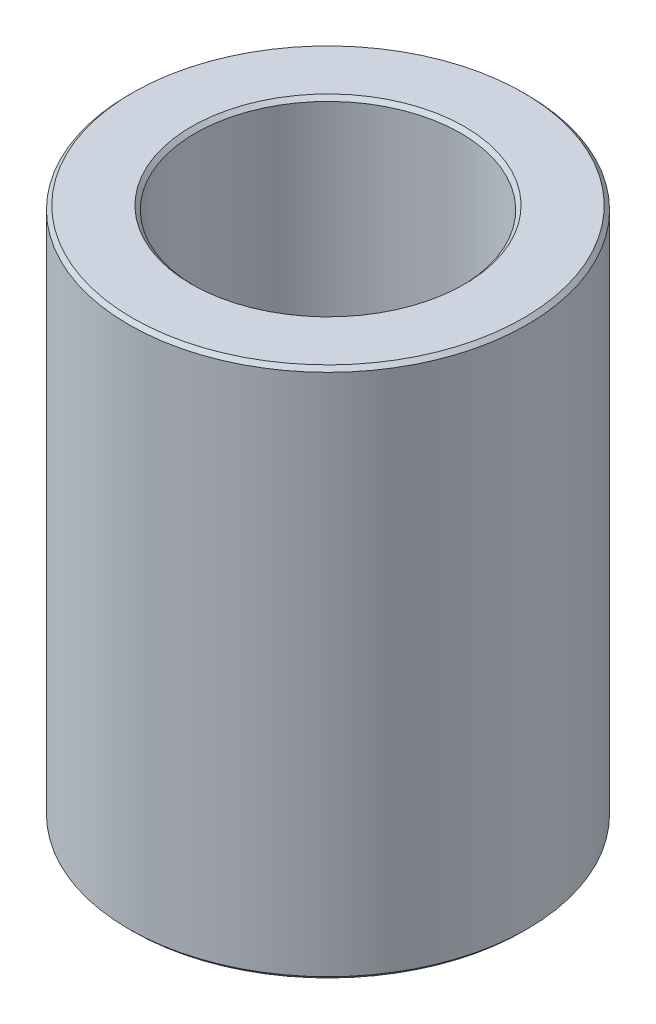
ISO-10303-21;
HEADER;
FILE_DESCRIPTION(('STEP AP214'),'2;1');
FILE_NAME('part.step','',(''),(''),'','','');
FILE_SCHEMA(('AUTOMOTIVE_DESIGN { 1 0 10303 214 1 1 1 1 }'));
ENDSEC;
DATA;
#1=APPLICATION_CONTEXT('core data for automotive mechanical design processes');
#2=APPLICATION_PROTOCOL_DEFINITION('international standard','automotive_design',2000,#1);
#3=PRODUCT_CONTEXT('',#1,'mechanical');
#4=PRODUCT('Part','Part','',(#3));
#5=PRODUCT_RELATED_PRODUCT_CATEGORY('part','',(#4));
#6=PRODUCT_DEFINITION_FORMATION('','',#4);
#7=PRODUCT_DEFINITION_CONTEXT('part definition',#1,'design');
#8=PRODUCT_DEFINITION('design','',#6,#7);
#9=PRODUCT_DEFINITION_SHAPE('','',#8);
#10=(LENGTH_UNIT() NAMED_UNIT(*) SI_UNIT(.MILLI.,.METRE.));
#11=(NAMED_UNIT(*) PLANE_ANGLE_UNIT() SI_UNIT($,.RADIAN.));
#12=(NAMED_UNIT(*) SI_UNIT($,.STERADIAN.) SOLID_ANGLE_UNIT());
#13=UNCERTAINTY_MEASURE_WITH_UNIT(LENGTH_MEASURE(1.E-05),#10,'distance_accuracy_value','');
#14=(GEOMETRIC_REPRESENTATION_CONTEXT(3) GLOBAL_UNCERTAINTY_ASSIGNED_CONTEXT((#13)) GLOBAL_UNIT_ASSIGNED_CONTEXT((#10,
#11,#12)) REPRESENTATION_CONTEXT('',''));
#15=CARTESIAN_POINT('',(0.,0.,0.));
#16=DIRECTION('',(0.,0.,1.));
#17=DIRECTION('',(1.,0.,0.));
#18=AXIS2_PLACEMENT_3D('',#15,#16,#17);
#19=CARTESIAN_POINT('',(0.,-14.,0.));
#20=DIRECTION('',(0.,1.,0.));
#21=DIRECTION('',(0.,0.,1.));
#22=AXIS2_PLACEMENT_3D('',#19,#20,#21);
#23=CYLINDRICAL_SURFACE('',#22,10.5);
#24=CARTESIAN_POINT('',(0.,-13.8,0.));
#25=DIRECTION('',(0.,1.,0.));
#26=DIRECTION('',(0.,0.,1.));
#27=AXIS2_PLACEMENT_3D('',#24,#25,#26);
#28=CIRCLE('',#27,10.5);
#29=CARTESIAN_POINT('',(0.,-13.8,10.5));
#30=VERTEX_POINT('',#29);
#31=EDGE_CURVE('E41',#30,#30,#28,.T.);
#32=ORIENTED_EDGE('',*,*,#31,.T.);
#33=EDGE_LOOP('',(#32));
#34=FACE_BOUND('',#33,.T.);
#35=CARTESIAN_POINT('',(0.,13.8,0.));
#36=DIRECTION('',(0.,1.,0.));
#37=DIRECTION('',(0.,0.,1.));
#38=AXIS2_PLACEMENT_3D('',#35,#36,#37);
#39=CIRCLE('',#38,10.5);
#40=CARTESIAN_POINT('',(0.,13.8,10.5));
#41=VERTEX_POINT('',#40);
#42=EDGE_CURVE('E45',#41,#41,#39,.F.);
#43=ORIENTED_EDGE('',*,*,#42,.T.);
#44=EDGE_LOOP('',(#43));
#45=FACE_BOUND('',#44,.T.);
#46=ADVANCED_FACE('F30',(#34,#45),#23,.T.);
#47=CARTESIAN_POINT('',(0.,-14.,0.));
#48=DIRECTION('',(0.,1.,0.));
#49=DIRECTION('',(0.,0.,1.));
#50=AXIS2_PLACEMENT_3D('',#47,#48,#49);
#51=PLANE('',#50);
#52=CARTESIAN_POINT('',(0.,-14.,0.));
#53=DIRECTION('',(0.,1.,0.));
#54=DIRECTION('',(0.,0.,1.));
#55=AXIS2_PLACEMENT_3D('',#52,#53,#54);
#56=CIRCLE('',#55,7.2);
#57=CARTESIAN_POINT('',(0.,-14.,7.2));
#58=VERTEX_POINT('',#57);
#59=EDGE_CURVE('E56',#58,#58,#56,.T.);
#60=ORIENTED_EDGE('',*,*,#59,.T.);
#61=EDGE_LOOP('',(#60));
#62=FACE_BOUND('',#61,.T.);
#63=CARTESIAN_POINT('',(0.,-14.,0.));
#64=DIRECTION('',(0.,1.,0.));
#65=DIRECTION('',(0.,0.,1.));
#66=AXIS2_PLACEMENT_3D('',#63,#64,#65);
#67=CIRCLE('',#66,10.3);
#68=CARTESIAN_POINT('',(0.,-14.,10.3));
#69=VERTEX_POINT('',#68);
#70=EDGE_CURVE('E59',#69,#69,#67,.F.);
#71=ORIENTED_EDGE('',*,*,#70,.T.);
#72=EDGE_LOOP('',(#71));
#73=FACE_BOUND('',#72,.T.);
#74=ADVANCED_FACE('F63',(#62,#73),#51,.F.);
#75=CARTESIAN_POINT('',(0.,-14.,0.));
#76=DIRECTION('',(0.,1.,0.));
#77=DIRECTION('',(0.,0.,1.));
#78=AXIS2_PLACEMENT_3D('',#75,#76,#77);
#79=CYLINDRICAL_SURFACE('',#78,7.);
#80=CARTESIAN_POINT('',(0.,-13.8,0.));
#81=DIRECTION('',(0.,1.,0.));
#82=DIRECTION('',(0.,0.,1.));
#83=AXIS2_PLACEMENT_3D('',#80,#81,#82);
#84=CIRCLE('',#83,7.);
#85=CARTESIAN_POINT('',(0.,-13.8,7.));
#86=VERTEX_POINT('',#85);
#87=EDGE_CURVE('E50',#86,#86,#84,.F.);
#88=ORIENTED_EDGE('',*,*,#87,.T.);
#89=EDGE_LOOP('',(#88));
#90=FACE_BOUND('',#89,.T.);
#91=CARTESIAN_POINT('',(0.,13.8,0.));
#92=DIRECTION('',(0.,1.,0.));
#93=DIRECTION('',(0.,0.,1.));
#94=AXIS2_PLACEMENT_3D('',#91,#92,#93);
#95=CIRCLE('',#94,7.);
#96=CARTESIAN_POINT('',(0.,13.8,7.));
#97=VERTEX_POINT('',#96);
#98=EDGE_CURVE('E53',#97,#97,#95,.T.);
#99=ORIENTED_EDGE('',*,*,#98,.T.);
#100=EDGE_LOOP('',(#99));
#101=FACE_BOUND('',#100,.T.);
#102=ADVANCED_FACE('F91',(#90,#101),#79,.F.);
#103=CARTESIAN_POINT('',(0.,14.,0.));
#104=DIRECTION('',(0.,1.,0.));
#105=DIRECTION('',(0.,0.,1.));
#106=AXIS2_PLACEMENT_3D('',#103,#104,#105);
#107=PLANE('',#106);
#108=CARTESIAN_POINT('',(0.,14.,0.));
#109=DIRECTION('',(0.,1.,0.));
#110=DIRECTION('',(0.,0.,1.));
#111=AXIS2_PLACEMENT_3D('',#108,#109,#110);
#112=CIRCLE('',#111,10.3);
#113=CARTESIAN_POINT('',(0.,14.,10.3));
#114=VERTEX_POINT('',#113);
#115=EDGE_CURVE('E10',#114,#114,#112,.T.);
#116=ORIENTED_EDGE('',*,*,#115,.T.);
#117=EDGE_LOOP('',(#116));
#118=FACE_BOUND('',#117,.T.);
#119=CARTESIAN_POINT('',(0.,14.,0.));
#120=DIRECTION('',(0.,1.,0.));
#121=DIRECTION('',(0.,0.,1.));
#122=AXIS2_PLACEMENT_3D('',#119,#120,#121);
#123=CIRCLE('',#122,7.19999999999999);
#124=CARTESIAN_POINT('',(0.,14.,7.19999999999999));
#125=VERTEX_POINT('',#124);
#126=EDGE_CURVE('E37',#125,#125,#123,.F.);
#127=ORIENTED_EDGE('',*,*,#126,.T.);
#128=EDGE_LOOP('',(#127));
#129=FACE_BOUND('',#128,.T.);
#130=ADVANCED_FACE('F86',(#118,#129),#107,.T.);
#131=CARTESIAN_POINT('',(0.,-14.,0.));
#132=DIRECTION('',(0.,-1.,0.));
#133=DIRECTION('',(0.,0.,-1.));
#134=AXIS2_PLACEMENT_3D('',#131,#132,#133);
#135=CONICAL_SURFACE('',#134,7.2,0.78539816339745);
#136=ORIENTED_EDGE('',*,*,#87,.F.);
#137=EDGE_LOOP('',(#136));
#138=FACE_BOUND('',#137,.T.);
#139=ORIENTED_EDGE('',*,*,#59,.F.);
#140=EDGE_LOOP('',(#139));
#141=FACE_BOUND('',#140,.T.);
#142=ADVANCED_FACE('F69',(#138,#141),#135,.F.);
#143=CARTESIAN_POINT('',(0.,-13.8,0.));
#144=DIRECTION('',(0.,1.,0.));
#145=DIRECTION('',(0.,0.,1.));
#146=AXIS2_PLACEMENT_3D('',#143,#144,#145);
#147=CONICAL_SURFACE('',#146,10.5,0.785398163397444);
#148=ORIENTED_EDGE('',*,*,#70,.F.);
#149=EDGE_LOOP('',(#148));
#150=FACE_BOUND('',#149,.T.);
#151=ORIENTED_EDGE('',*,*,#31,.F.);
#152=EDGE_LOOP('',(#151));
#153=FACE_BOUND('',#152,.T.);
#154=ADVANCED_FACE('F65',(#150,#153),#147,.T.);
#155=CARTESIAN_POINT('',(0.,14.,0.));
#156=DIRECTION('',(0.,-1.,0.));
#157=DIRECTION('',(0.,0.,-1.));
#158=AXIS2_PLACEMENT_3D('',#155,#156,#157);
#159=CONICAL_SURFACE('',#158,10.3,0.785398163397448);
#160=ORIENTED_EDGE('',*,*,#42,.F.);
#161=EDGE_LOOP('',(#160));
#162=FACE_BOUND('',#161,.T.);
#163=ORIENTED_EDGE('',*,*,#115,.F.);
#164=EDGE_LOOP('',(#163));
#165=FACE_BOUND('',#164,.T.);
#166=ADVANCED_FACE('F68',(#162,#165),#159,.T.);
#167=CARTESIAN_POINT('',(0.,13.8,0.));
#168=DIRECTION('',(0.,1.,0.));
#169=DIRECTION('',(0.,0.,1.));
#170=AXIS2_PLACEMENT_3D('',#167,#168,#169);
#171=CONICAL_SURFACE('',#170,7.,0.785398163397431);
#172=ORIENTED_EDGE('',*,*,#126,.F.);
#173=EDGE_LOOP('',(#172));
#174=FACE_BOUND('',#173,.T.);
#175=ORIENTED_EDGE('',*,*,#98,.F.);
#176=EDGE_LOOP('',(#175));
#177=FACE_BOUND('',#176,.T.);
#178=ADVANCED_FACE('F32',(#174,#177),#171,.F.);
#179=CLOSED_SHELL('',(#46,#74,#102,#130,#142,#154,#166,#178));
#180=MANIFOLD_SOLID_BREP('B2',#179);
#181=ADVANCED_BREP_SHAPE_REPRESENTATION('',(#18,#180),#14);
#182=SHAPE_DEFINITION_REPRESENTATION(#9,#181);
ENDSEC;
END-ISO-10303-21;
